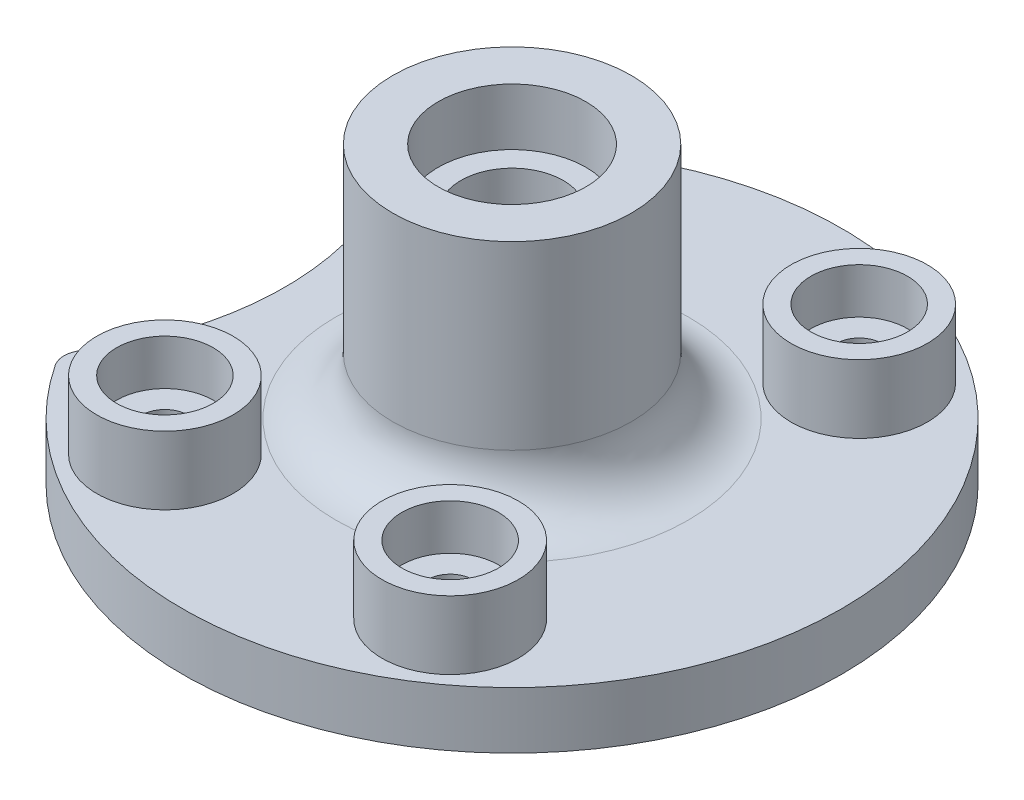
ISO-10303-21;
HEADER;
FILE_DESCRIPTION(('STEP AP214'),'2;1');
FILE_NAME('part.step','',(''),(''),'','','');
FILE_SCHEMA(('AUTOMOTIVE_DESIGN { 1 0 10303 214 1 1 1 1 }'));
ENDSEC;
DATA;
#1=APPLICATION_CONTEXT('core data for automotive mechanical design processes');
#2=APPLICATION_PROTOCOL_DEFINITION('international standard','automotive_design',2000,#1);
#3=PRODUCT_CONTEXT('',#1,'mechanical');
#4=PRODUCT('Part','Part','',(#3));
#5=PRODUCT_RELATED_PRODUCT_CATEGORY('part','',(#4));
#6=PRODUCT_DEFINITION_FORMATION('','',#4);
#7=PRODUCT_DEFINITION_CONTEXT('part definition',#1,'design');
#8=PRODUCT_DEFINITION('design','',#6,#7);
#9=PRODUCT_DEFINITION_SHAPE('','',#8);
#10=(LENGTH_UNIT() NAMED_UNIT(*) SI_UNIT(.MILLI.,.METRE.));
#11=(NAMED_UNIT(*) PLANE_ANGLE_UNIT() SI_UNIT($,.RADIAN.));
#12=(NAMED_UNIT(*) SI_UNIT($,.STERADIAN.) SOLID_ANGLE_UNIT());
#13=UNCERTAINTY_MEASURE_WITH_UNIT(LENGTH_MEASURE(1.E-05),#10,'distance_accuracy_value','');
#14=(GEOMETRIC_REPRESENTATION_CONTEXT(3) GLOBAL_UNCERTAINTY_ASSIGNED_CONTEXT((#13)) GLOBAL_UNIT_ASSIGNED_CONTEXT((#10,
#11,#12)) REPRESENTATION_CONTEXT('',''));
#15=CARTESIAN_POINT('',(0.,0.,0.));
#16=DIRECTION('',(0.,0.,1.));
#17=DIRECTION('',(1.,0.,0.));
#18=AXIS2_PLACEMENT_3D('',#15,#16,#17);
#19=CARTESIAN_POINT('',(12.5507555926685,-15.9,-17.998053071223));
#20=DIRECTION('',(0.,1.,0.));
#21=DIRECTION('',(0.,0.,1.));
#22=AXIS2_PLACEMENT_3D('',#19,#20,#21);
#23=CYLINDRICAL_SURFACE('',#22,2.);
#24=CARTESIAN_POINT('',(12.5507555926685,-8.9,-17.998053071223));
#25=DIRECTION('',(0.,1.,0.));
#26=DIRECTION('',(0.,0.,1.));
#27=AXIS2_PLACEMENT_3D('',#24,#25,#26);
#28=CIRCLE('',#27,2.);
#29=CARTESIAN_POINT('',(12.5507555926685,-8.9,-15.998053071223));
#30=VERTEX_POINT('',#29);
#31=EDGE_CURVE('E116',#30,#30,#28,.F.);
#32=ORIENTED_EDGE('',*,*,#31,.F.);
#33=EDGE_LOOP('',(#32));
#34=FACE_BOUND('',#33,.T.);
#35=CARTESIAN_POINT('',(12.5507555926685,-12.9,-17.998053071223));
#36=DIRECTION('',(0.,-1.,0.));
#37=DIRECTION('',(0.,0.,-1.));
#38=AXIS2_PLACEMENT_3D('',#35,#36,#37);
#39=CIRCLE('',#38,2.);
#40=CARTESIAN_POINT('',(12.5507555926685,-12.9,-19.998053071223));
#41=VERTEX_POINT('',#40);
#42=EDGE_CURVE('E42',#41,#41,#39,.T.);
#43=ORIENTED_EDGE('',*,*,#42,.T.);
#44=EDGE_LOOP('',(#43));
#45=FACE_BOUND('',#44,.T.);
#46=ADVANCED_FACE('F38',(#34,#45),#23,.F.);
#47=CARTESIAN_POINT('',(12.5507555926685,-15.9,17.998053071223));
#48=DIRECTION('',(0.,1.,0.));
#49=DIRECTION('',(0.,0.,1.));
#50=AXIS2_PLACEMENT_3D('',#47,#48,#49);
#51=CYLINDRICAL_SURFACE('',#50,2.);
#52=CARTESIAN_POINT('',(12.5507555926685,-8.9,17.998053071223));
#53=DIRECTION('',(0.,1.,0.));
#54=DIRECTION('',(0.,0.,1.));
#55=AXIS2_PLACEMENT_3D('',#52,#53,#54);
#56=CIRCLE('',#55,2.);
#57=CARTESIAN_POINT('',(12.5507555926685,-8.9,19.998053071223));
#58=VERTEX_POINT('',#57);
#59=EDGE_CURVE('E119',#58,#58,#56,.F.);
#60=ORIENTED_EDGE('',*,*,#59,.F.);
#61=EDGE_LOOP('',(#60));
#62=FACE_BOUND('',#61,.T.);
#63=CARTESIAN_POINT('',(12.5507555926685,-12.9,17.998053071223));
#64=DIRECTION('',(0.,-1.,0.));
#65=DIRECTION('',(0.,0.,-1.));
#66=AXIS2_PLACEMENT_3D('',#63,#64,#65);
#67=CIRCLE('',#66,2.);
#68=CARTESIAN_POINT('',(12.5507555926685,-12.9,15.998053071223));
#69=VERTEX_POINT('',#68);
#70=EDGE_CURVE('E122',#69,#69,#67,.T.);
#71=ORIENTED_EDGE('',*,*,#70,.T.);
#72=EDGE_LOOP('',(#71));
#73=FACE_BOUND('',#72,.T.);
#74=ADVANCED_FACE('F245',(#62,#73),#51,.F.);
#75=CARTESIAN_POINT('',(-12.5507555926685,-15.9,-17.998053071223));
#76=DIRECTION('',(0.,1.,0.));
#77=DIRECTION('',(0.,0.,1.));
#78=AXIS2_PLACEMENT_3D('',#75,#76,#77);
#79=CYLINDRICAL_SURFACE('',#78,2.);
#80=CARTESIAN_POINT('',(-12.5507555926685,-8.9,-17.998053071223));
#81=DIRECTION('',(0.,1.,0.));
#82=DIRECTION('',(0.,0.,1.));
#83=AXIS2_PLACEMENT_3D('',#80,#81,#82);
#84=CIRCLE('',#83,2.);
#85=CARTESIAN_POINT('',(-12.5507555926685,-8.9,-15.998053071223));
#86=VERTEX_POINT('',#85);
#87=EDGE_CURVE('E230',#86,#86,#84,.T.);
#88=ORIENTED_EDGE('',*,*,#87,.T.);
#89=EDGE_LOOP('',(#88));
#90=FACE_BOUND('',#89,.T.);
#91=CARTESIAN_POINT('',(-12.5507555926685,-12.9,-17.998053071223));
#92=DIRECTION('',(0.,-1.,0.));
#93=DIRECTION('',(0.,0.,-1.));
#94=AXIS2_PLACEMENT_3D('',#91,#92,#93);
#95=CIRCLE('',#94,2.);
#96=CARTESIAN_POINT('',(-12.5507555926685,-12.9,-19.998053071223));
#97=VERTEX_POINT('',#96);
#98=EDGE_CURVE('E108',#97,#97,#95,.F.);
#99=ORIENTED_EDGE('',*,*,#98,.F.);
#100=EDGE_LOOP('',(#99));
#101=FACE_BOUND('',#100,.T.);
#102=ADVANCED_FACE('F242',(#90,#101),#79,.F.);
#103=CARTESIAN_POINT('',(-12.5507555926685,-15.9,17.998053071223));
#104=DIRECTION('',(0.,1.,0.));
#105=DIRECTION('',(0.,0.,1.));
#106=AXIS2_PLACEMENT_3D('',#103,#104,#105);
#107=CYLINDRICAL_SURFACE('',#106,2.);
#108=CARTESIAN_POINT('',(-12.5507555926685,-8.9,17.998053071223));
#109=DIRECTION('',(0.,1.,0.));
#110=DIRECTION('',(0.,0.,1.));
#111=AXIS2_PLACEMENT_3D('',#108,#109,#110);
#112=CIRCLE('',#111,2.);
#113=CARTESIAN_POINT('',(-12.5507555926685,-8.9,19.998053071223));
#114=VERTEX_POINT('',#113);
#115=EDGE_CURVE('E182',#114,#114,#112,.T.);
#116=ORIENTED_EDGE('',*,*,#115,.T.);
#117=EDGE_LOOP('',(#116));
#118=FACE_BOUND('',#117,.T.);
#119=CARTESIAN_POINT('',(-12.5507555926685,-12.9,17.998053071223));
#120=DIRECTION('',(0.,-1.,0.));
#121=DIRECTION('',(0.,0.,-1.));
#122=AXIS2_PLACEMENT_3D('',#119,#120,#121);
#123=CIRCLE('',#122,2.);
#124=CARTESIAN_POINT('',(-12.5507555926685,-12.9,15.998053071223));
#125=VERTEX_POINT('',#124);
#126=EDGE_CURVE('E169',#125,#125,#123,.F.);
#127=ORIENTED_EDGE('',*,*,#126,.F.);
#128=EDGE_LOOP('',(#127));
#129=FACE_BOUND('',#128,.T.);
#130=ADVANCED_FACE('F244',(#118,#129),#107,.F.);
#131=CARTESIAN_POINT('',(0.,-5.,-6.5));
#132=DIRECTION('',(0.,-1.,0.));
#133=DIRECTION('',(0.,0.,-1.));
#134=AXIS2_PLACEMENT_3D('',#131,#132,#133);
#135=PLANE('',#134);
#136=CARTESIAN_POINT('',(0.,-5.,0.));
#137=DIRECTION('',(0.,-1.,0.));
#138=DIRECTION('',(0.,0.,-1.));
#139=AXIS2_PLACEMENT_3D('',#136,#137,#138);
#140=CIRCLE('',#139,6.5);
#141=CARTESIAN_POINT('',(0.,-5.,-6.5));
#142=VERTEX_POINT('',#141);
#143=EDGE_CURVE('E210',#142,#142,#140,.T.);
#144=ORIENTED_EDGE('',*,*,#143,.T.);
#145=EDGE_LOOP('',(#144));
#146=FACE_BOUND('',#145,.T.);
#147=CARTESIAN_POINT('',(0.,-5.,0.));
#148=DIRECTION('',(0.,-1.,0.));
#149=DIRECTION('',(0.,0.,-1.));
#150=AXIS2_PLACEMENT_3D('',#147,#148,#149);
#151=CIRCLE('',#150,4.5);
#152=CARTESIAN_POINT('',(0.,-5.,-4.5));
#153=VERTEX_POINT('',#152);
#154=EDGE_CURVE('E213',#153,#153,#151,.T.);
#155=ORIENTED_EDGE('',*,*,#154,.F.);
#156=EDGE_LOOP('',(#155));
#157=FACE_BOUND('',#156,.T.);
#158=ADVANCED_FACE('F252',(#146,#157),#135,.T.);
#159=CARTESIAN_POINT('',(0.,0.,0.));
#160=DIRECTION('',(0.,-1.,0.));
#161=DIRECTION('',(0.,0.,-1.));
#162=AXIS2_PLACEMENT_3D('',#159,#160,#161);
#163=CYLINDRICAL_SURFACE('',#162,6.5);
#164=ORIENTED_EDGE('',*,*,#143,.F.);
#165=EDGE_LOOP('',(#164));
#166=FACE_BOUND('',#165,.T.);
#167=CARTESIAN_POINT('',(0.,-15.9,0.));
#168=DIRECTION('',(0.,1.,0.));
#169=DIRECTION('',(0.,0.,1.));
#170=AXIS2_PLACEMENT_3D('',#167,#168,#169);
#171=CIRCLE('',#170,6.5);
#172=CARTESIAN_POINT('',(0.,-15.9,6.5));
#173=VERTEX_POINT('',#172);
#174=EDGE_CURVE('E191',#173,#173,#171,.T.);
#175=ORIENTED_EDGE('',*,*,#174,.F.);
#176=EDGE_LOOP('',(#175));
#177=FACE_BOUND('',#176,.T.);
#178=ADVANCED_FACE('F359',(#166,#177),#163,.F.);
#179=CARTESIAN_POINT('',(0.,0.,0.));
#180=DIRECTION('',(0.,-1.,0.));
#181=DIRECTION('',(0.,0.,-1.));
#182=AXIS2_PLACEMENT_3D('',#179,#180,#181);
#183=CYLINDRICAL_SURFACE('',#182,10.5);
#184=CARTESIAN_POINT('',(0.,-5.9,0.));
#185=DIRECTION('',(0.,-1.,0.));
#186=DIRECTION('',(0.,0.,-1.));
#187=AXIS2_PLACEMENT_3D('',#184,#185,#186);
#188=CIRCLE('',#187,10.5);
#189=CARTESIAN_POINT('',(0.,-5.9,-10.5));
#190=VERTEX_POINT('',#189);
#191=EDGE_CURVE('E219',#190,#190,#188,.F.);
#192=ORIENTED_EDGE('',*,*,#191,.T.);
#193=EDGE_LOOP('',(#192));
#194=FACE_BOUND('',#193,.T.);
#195=CARTESIAN_POINT('',(0.,10.,0.));
#196=DIRECTION('',(0.,-1.,0.));
#197=DIRECTION('',(0.,0.,-1.));
#198=AXIS2_PLACEMENT_3D('',#195,#196,#197);
#199=CIRCLE('',#198,10.5);
#200=CARTESIAN_POINT('',(0.,10.,-10.5));
#201=VERTEX_POINT('',#200);
#202=EDGE_CURVE('E207',#201,#201,#199,.T.);
#203=ORIENTED_EDGE('',*,*,#202,.T.);
#204=EDGE_LOOP('',(#203));
#205=FACE_BOUND('',#204,.T.);
#206=ADVANCED_FACE('F355',(#194,#205),#183,.T.);
#207=CARTESIAN_POINT('',(0.,10.,-6.5));
#208=DIRECTION('',(0.,1.,0.));
#209=DIRECTION('',(0.,0.,1.));
#210=AXIS2_PLACEMENT_3D('',#207,#208,#209);
#211=PLANE('',#210);
#212=CARTESIAN_POINT('',(0.,10.,0.));
#213=DIRECTION('',(0.,-1.,0.));
#214=DIRECTION('',(0.,0.,-1.));
#215=AXIS2_PLACEMENT_3D('',#212,#213,#214);
#216=CIRCLE('',#215,6.5);
#217=CARTESIAN_POINT('',(0.,10.,-6.5));
#218=VERTEX_POINT('',#217);
#219=EDGE_CURVE('E204',#218,#218,#216,.T.);
#220=ORIENTED_EDGE('',*,*,#219,.T.);
#221=EDGE_LOOP('',(#220));
#222=FACE_BOUND('',#221,.T.);
#223=ORIENTED_EDGE('',*,*,#202,.F.);
#224=EDGE_LOOP('',(#223));
#225=FACE_BOUND('',#224,.T.);
#226=ADVANCED_FACE('F351',(#222,#225),#211,.T.);
#227=CARTESIAN_POINT('',(0.,0.,0.));
#228=DIRECTION('',(0.,-1.,0.));
#229=DIRECTION('',(0.,0.,-1.));
#230=AXIS2_PLACEMENT_3D('',#227,#228,#229);
#231=CYLINDRICAL_SURFACE('',#230,6.5);
#232=CARTESIAN_POINT('',(0.,5.,0.));
#233=DIRECTION('',(0.,-1.,0.));
#234=DIRECTION('',(0.,0.,-1.));
#235=AXIS2_PLACEMENT_3D('',#232,#233,#234);
#236=CIRCLE('',#235,6.5);
#237=CARTESIAN_POINT('',(0.,5.,-6.5));
#238=VERTEX_POINT('',#237);
#239=EDGE_CURVE('E201',#238,#238,#236,.T.);
#240=ORIENTED_EDGE('',*,*,#239,.T.);
#241=EDGE_LOOP('',(#240));
#242=FACE_BOUND('',#241,.T.);
#243=ORIENTED_EDGE('',*,*,#219,.F.);
#244=EDGE_LOOP('',(#243));
#245=FACE_BOUND('',#244,.T.);
#246=ADVANCED_FACE('F347',(#242,#245),#231,.F.);
#247=CARTESIAN_POINT('',(0.,5.,-6.5));
#248=DIRECTION('',(0.,1.,0.));
#249=DIRECTION('',(0.,0.,1.));
#250=AXIS2_PLACEMENT_3D('',#247,#248,#249);
#251=PLANE('',#250);
#252=CARTESIAN_POINT('',(0.,5.,0.));
#253=DIRECTION('',(0.,-1.,0.));
#254=DIRECTION('',(0.,0.,-1.));
#255=AXIS2_PLACEMENT_3D('',#252,#253,#254);
#256=CIRCLE('',#255,4.5);
#257=CARTESIAN_POINT('',(0.,5.,-4.5));
#258=VERTEX_POINT('',#257);
#259=EDGE_CURVE('E197',#258,#258,#256,.T.);
#260=ORIENTED_EDGE('',*,*,#259,.T.);
#261=EDGE_LOOP('',(#260));
#262=FACE_BOUND('',#261,.T.);
#263=ORIENTED_EDGE('',*,*,#239,.F.);
#264=EDGE_LOOP('',(#263));
#265=FACE_BOUND('',#264,.T.);
#266=ADVANCED_FACE('F340',(#262,#265),#251,.T.);
#267=CARTESIAN_POINT('',(0.,0.,0.));
#268=DIRECTION('',(0.,-1.,0.));
#269=DIRECTION('',(0.,0.,-1.));
#270=AXIS2_PLACEMENT_3D('',#267,#268,#269);
#271=CYLINDRICAL_SURFACE('',#270,4.5);
#272=ORIENTED_EDGE('',*,*,#154,.T.);
#273=EDGE_LOOP('',(#272));
#274=FACE_BOUND('',#273,.T.);
#275=ORIENTED_EDGE('',*,*,#259,.F.);
#276=EDGE_LOOP('',(#275));
#277=FACE_BOUND('',#276,.T.);
#278=ADVANCED_FACE('F333',(#274,#277),#271,.F.);
#279=CARTESIAN_POINT('',(0.,-15.9,0.));
#280=DIRECTION('',(0.,1.,0.));
#281=DIRECTION('',(0.,0.,1.));
#282=AXIS2_PLACEMENT_3D('',#279,#280,#281);
#283=CYLINDRICAL_SURFACE('',#282,29.);
#284=CARTESIAN_POINT('',(0.,-10.9,0.));
#285=DIRECTION('',(0.,1.,0.));
#286=DIRECTION('',(0.,0.,-1.));
#287=AXIS2_PLACEMENT_3D('',#284,#285,#286);
#288=CIRCLE('',#287,29.);
#289=CARTESIAN_POINT('',(-24.1666666666667,-10.9,16.0303531533844));
#290=VERTEX_POINT('',#289);
#291=CARTESIAN_POINT('',(-24.1666666666667,-10.9,-16.0303531533844));
#292=VERTEX_POINT('',#291);
#293=EDGE_CURVE('E85',#290,#292,#288,.T.);
#294=ORIENTED_EDGE('',*,*,#293,.F.);
#295=DIRECTION('',(0.,1.,0.));
#296=VECTOR('',#295,1.);
#297=CARTESIAN_POINT('',(-24.1666666666667,-15.9,16.0303531533844));
#298=LINE('',#297,#296);
#299=CARTESIAN_POINT('',(-24.1666666666667,-15.9,16.0303531533844));
#300=VERTEX_POINT('',#299);
#301=EDGE_CURVE('E61',#290,#300,#298,.F.);
#302=ORIENTED_EDGE('',*,*,#301,.T.);
#303=CARTESIAN_POINT('',(0.,-15.9,0.));
#304=DIRECTION('',(0.,1.,0.));
#305=DIRECTION('',(0.,0.,-1.));
#306=AXIS2_PLACEMENT_3D('',#303,#304,#305);
#307=CIRCLE('',#306,29.);
#308=CARTESIAN_POINT('',(-24.1666666666667,-15.9,-16.0303531533844));
#309=VERTEX_POINT('',#308);
#310=EDGE_CURVE('E99',#300,#309,#307,.T.);
#311=ORIENTED_EDGE('',*,*,#310,.T.);
#312=DIRECTION('',(0.,1.,0.));
#313=VECTOR('',#312,1.);
#314=CARTESIAN_POINT('',(-24.1666666666667,-15.9,-16.0303531533844));
#315=LINE('',#314,#313);
#316=EDGE_CURVE('E112',#309,#292,#315,.T.);
#317=ORIENTED_EDGE('',*,*,#316,.T.);
#318=EDGE_LOOP('',(#294,#302,#311,#317));
#319=FACE_BOUND('',#318,.T.);
#320=ADVANCED_FACE('F331',(#319),#283,.T.);
#321=CARTESIAN_POINT('',(-45.,-15.9,0.));
#322=DIRECTION('',(0.,1.,0.));
#323=DIRECTION('',(0.,0.,1.));
#324=AXIS2_PLACEMENT_3D('',#321,#322,#323);
#325=CYLINDRICAL_SURFACE('',#324,25.);
#326=CARTESIAN_POINT('',(-45.,-15.9,0.));
#327=DIRECTION('',(0.,-1.,0.));
#328=DIRECTION('',(0.,0.,-1.));
#329=AXIS2_PLACEMENT_3D('',#326,#327,#328);
#330=CIRCLE('',#329,25.);
#331=CARTESIAN_POINT('',(-24.1666666666667,-15.9,-13.8192699598142));
#332=VERTEX_POINT('',#331);
#333=CARTESIAN_POINT('',(-24.1666666666667,-15.9,13.8192699598142));
#334=VERTEX_POINT('',#333);
#335=EDGE_CURVE('E195',#332,#334,#330,.T.);
#336=ORIENTED_EDGE('',*,*,#335,.T.);
#337=DIRECTION('',(0.,1.,0.));
#338=VECTOR('',#337,1.);
#339=CARTESIAN_POINT('',(-24.1666666666667,-15.9,13.8192699598142));
#340=LINE('',#339,#338);
#341=CARTESIAN_POINT('',(-24.1666666666667,-10.9,13.8192699598142));
#342=VERTEX_POINT('',#341);
#343=EDGE_CURVE('E91',#334,#342,#340,.T.);
#344=ORIENTED_EDGE('',*,*,#343,.T.);
#345=CARTESIAN_POINT('',(-45.,-10.9,0.));
#346=DIRECTION('',(0.,-1.,0.));
#347=DIRECTION('',(0.,0.,-1.));
#348=AXIS2_PLACEMENT_3D('',#345,#346,#347);
#349=CIRCLE('',#348,25.);
#350=CARTESIAN_POINT('',(-24.1666666666667,-10.9,-13.8192699598142));
#351=VERTEX_POINT('',#350);
#352=EDGE_CURVE('E84',#351,#342,#349,.T.);
#353=ORIENTED_EDGE('',*,*,#352,.F.);
#354=DIRECTION('',(0.,1.,0.));
#355=VECTOR('',#354,1.);
#356=CARTESIAN_POINT('',(-24.1666666666667,-15.9,-13.8192699598142));
#357=LINE('',#356,#355);
#358=EDGE_CURVE('E97',#351,#332,#357,.F.);
#359=ORIENTED_EDGE('',*,*,#358,.T.);
#360=EDGE_LOOP('',(#336,#344,#353,#359));
#361=FACE_BOUND('',#360,.T.);
#362=ADVANCED_FACE('F96',(#361),#325,.F.);
#363=CARTESIAN_POINT('',(-22.5,-15.9,0.));
#364=DIRECTION('',(0.,-1.,0.));
#365=DIRECTION('',(0.,0.,-1.));
#366=AXIS2_PLACEMENT_3D('',#363,#364,#365);
#367=PLANE('',#366);
#368=CARTESIAN_POINT('',(12.5507555926685,-15.9,17.998053071223));
#369=DIRECTION('',(0.,1.,0.));
#370=DIRECTION('',(0.,0.,-1.));
#371=AXIS2_PLACEMENT_3D('',#368,#369,#370);
#372=CIRCLE('',#371,3.);
#373=CARTESIAN_POINT('',(12.5507555926685,-15.9,14.998053071223));
#374=VERTEX_POINT('',#373);
#375=EDGE_CURVE('E129',#374,#374,#372,.T.);
#376=ORIENTED_EDGE('',*,*,#375,.T.);
#377=EDGE_LOOP('',(#376));
#378=FACE_BOUND('',#377,.T.);
#379=CARTESIAN_POINT('',(12.5507555926685,-15.9,-17.998053071223));
#380=DIRECTION('',(0.,1.,0.));
#381=DIRECTION('',(0.,0.,-1.));
#382=AXIS2_PLACEMENT_3D('',#379,#380,#381);
#383=CIRCLE('',#382,3.);
#384=CARTESIAN_POINT('',(12.5507555926685,-15.9,-20.998053071223));
#385=VERTEX_POINT('',#384);
#386=EDGE_CURVE('E139',#385,#385,#383,.T.);
#387=ORIENTED_EDGE('',*,*,#386,.T.);
#388=EDGE_LOOP('',(#387));
#389=FACE_BOUND('',#388,.T.);
#390=CARTESIAN_POINT('',(-12.5507555926685,-15.9,17.998053071223));
#391=DIRECTION('',(0.,-1.,0.));
#392=DIRECTION('',(0.,0.,-1.));
#393=AXIS2_PLACEMENT_3D('',#390,#391,#392);
#394=CIRCLE('',#393,3.);
#395=CARTESIAN_POINT('',(-12.5507555926685,-15.9,14.998053071223));
#396=VERTEX_POINT('',#395);
#397=EDGE_CURVE('E170',#396,#396,#394,.T.);
#398=ORIENTED_EDGE('',*,*,#397,.F.);
#399=EDGE_LOOP('',(#398));
#400=FACE_BOUND('',#399,.T.);
#401=CARTESIAN_POINT('',(-12.5507555926685,-15.9,-17.998053071223));
#402=DIRECTION('',(0.,-1.,0.));
#403=DIRECTION('',(0.,0.,-1.));
#404=AXIS2_PLACEMENT_3D('',#401,#402,#403);
#405=CIRCLE('',#404,3.);
#406=CARTESIAN_POINT('',(-12.5507555926685,-15.9,-20.998053071223));
#407=VERTEX_POINT('',#406);
#408=EDGE_CURVE('E163',#407,#407,#405,.T.);
#409=ORIENTED_EDGE('',*,*,#408,.F.);
#410=EDGE_LOOP('',(#409));
#411=FACE_BOUND('',#410,.T.);
#412=ORIENTED_EDGE('',*,*,#174,.T.);
#413=EDGE_LOOP('',(#412));
#414=FACE_BOUND('',#413,.T.);
#415=ORIENTED_EDGE('',*,*,#310,.F.);
#416=CARTESIAN_POINT('',(-22.5,-15.9,14.9248115565993));
#417=DIRECTION('',(0.,-1.,0.));
#418=DIRECTION('',(0.,0.,-1.));
#419=AXIS2_PLACEMENT_3D('',#416,#417,#418);
#420=CIRCLE('',#419,2.);
#421=EDGE_CURVE('E11',#300,#334,#420,.T.);
#422=ORIENTED_EDGE('',*,*,#421,.T.);
#423=ORIENTED_EDGE('',*,*,#335,.F.);
#424=CARTESIAN_POINT('',(-22.5,-15.9,-14.9248115565993));
#425=DIRECTION('',(0.,-1.,0.));
#426=DIRECTION('',(0.,0.,-1.));
#427=AXIS2_PLACEMENT_3D('',#424,#425,#426);
#428=CIRCLE('',#427,2.);
#429=EDGE_CURVE('E47',#332,#309,#428,.T.);
#430=ORIENTED_EDGE('',*,*,#429,.T.);
#431=EDGE_LOOP('',(#415,#422,#423,#430));
#432=FACE_BOUND('',#431,.T.);
#433=ADVANCED_FACE('F324',(#378,#389,#400,#411,#414,#432),#367,.T.);
#434=CARTESIAN_POINT('',(-22.5,-10.9,0.));
#435=DIRECTION('',(0.,-1.,0.));
#436=DIRECTION('',(0.,0.,-1.));
#437=AXIS2_PLACEMENT_3D('',#434,#435,#436);
#438=PLANE('',#437);
#439=CARTESIAN_POINT('',(12.5507555926685,-10.9,17.998053071223));
#440=DIRECTION('',(0.,-1.,0.));
#441=DIRECTION('',(0.,0.,-1.));
#442=AXIS2_PLACEMENT_3D('',#439,#440,#441);
#443=CIRCLE('',#442,6.);
#444=CARTESIAN_POINT('',(12.5507555926685,-10.9,11.998053071223));
#445=VERTEX_POINT('',#444);
#446=EDGE_CURVE('E150',#445,#445,#443,.T.);
#447=ORIENTED_EDGE('',*,*,#446,.T.);
#448=EDGE_LOOP('',(#447));
#449=FACE_BOUND('',#448,.T.);
#450=CARTESIAN_POINT('',(12.5507555926685,-10.9,-17.998053071223));
#451=DIRECTION('',(0.,-1.,0.));
#452=DIRECTION('',(0.,0.,1.));
#453=AXIS2_PLACEMENT_3D('',#450,#451,#452);
#454=CIRCLE('',#453,6.);
#455=CARTESIAN_POINT('',(12.5507555926685,-10.9,-11.998053071223));
#456=VERTEX_POINT('',#455);
#457=EDGE_CURVE('E159',#456,#456,#454,.T.);
#458=ORIENTED_EDGE('',*,*,#457,.T.);
#459=EDGE_LOOP('',(#458));
#460=FACE_BOUND('',#459,.T.);
#461=CARTESIAN_POINT('',(-12.5507555926685,-10.9,17.998053071223));
#462=DIRECTION('',(0.,-1.,0.));
#463=DIRECTION('',(0.,0.,-1.));
#464=AXIS2_PLACEMENT_3D('',#461,#462,#463);
#465=CIRCLE('',#464,6.);
#466=CARTESIAN_POINT('',(-12.5507555926685,-10.9,11.998053071223));
#467=VERTEX_POINT('',#466);
#468=EDGE_CURVE('E225',#467,#467,#465,.F.);
#469=ORIENTED_EDGE('',*,*,#468,.F.);
#470=EDGE_LOOP('',(#469));
#471=FACE_BOUND('',#470,.T.);
#472=CARTESIAN_POINT('',(-12.5507555926685,-10.9,-17.998053071223));
#473=DIRECTION('',(0.,-1.,0.));
#474=DIRECTION('',(0.,0.,-1.));
#475=AXIS2_PLACEMENT_3D('',#472,#473,#474);
#476=CIRCLE('',#475,6.);
#477=CARTESIAN_POINT('',(-12.5507555926685,-10.9,-23.998053071223));
#478=VERTEX_POINT('',#477);
#479=EDGE_CURVE('E222',#478,#478,#476,.F.);
#480=ORIENTED_EDGE('',*,*,#479,.F.);
#481=EDGE_LOOP('',(#480));
#482=FACE_BOUND('',#481,.T.);
#483=CARTESIAN_POINT('',(0.,-10.9,0.));
#484=DIRECTION('',(0.,-1.,0.));
#485=DIRECTION('',(0.,0.,-1.));
#486=AXIS2_PLACEMENT_3D('',#483,#484,#485);
#487=CIRCLE('',#486,15.5);
#488=CARTESIAN_POINT('',(0.,-10.9,-15.5));
#489=VERTEX_POINT('',#488);
#490=EDGE_CURVE('E216',#489,#489,#487,.T.);
#491=ORIENTED_EDGE('',*,*,#490,.T.);
#492=EDGE_LOOP('',(#491));
#493=FACE_BOUND('',#492,.T.);
#494=ORIENTED_EDGE('',*,*,#352,.T.);
#495=CARTESIAN_POINT('',(-22.5,-10.9,14.9248115565993));
#496=DIRECTION('',(0.,-1.,0.));
#497=DIRECTION('',(0.,0.,-1.));
#498=AXIS2_PLACEMENT_3D('',#495,#496,#497);
#499=CIRCLE('',#498,2.);
#500=EDGE_CURVE('E90',#342,#290,#499,.F.);
#501=ORIENTED_EDGE('',*,*,#500,.T.);
#502=ORIENTED_EDGE('',*,*,#293,.T.);
#503=CARTESIAN_POINT('',(-22.5,-10.9,-14.9248115565993));
#504=DIRECTION('',(0.,-1.,0.));
#505=DIRECTION('',(0.,0.,-1.));
#506=AXIS2_PLACEMENT_3D('',#503,#504,#505);
#507=CIRCLE('',#506,2.);
#508=EDGE_CURVE('E81',#292,#351,#507,.F.);
#509=ORIENTED_EDGE('',*,*,#508,.T.);
#510=EDGE_LOOP('',(#494,#501,#502,#509));
#511=FACE_BOUND('',#510,.T.);
#512=ADVANCED_FACE('F83',(#449,#460,#471,#482,#493,#511),#438,.F.);
#513=CARTESIAN_POINT('',(0.,-5.9,0.));
#514=DIRECTION('',(0.,-1.,0.));
#515=DIRECTION('',(0.,0.,-1.));
#516=AXIS2_PLACEMENT_3D('',#513,#514,#515);
#517=TOROIDAL_SURFACE('',#516,15.5,5.);
#518=ORIENTED_EDGE('',*,*,#191,.F.);
#519=EDGE_LOOP('',(#518));
#520=FACE_BOUND('',#519,.T.);
#521=ORIENTED_EDGE('',*,*,#490,.F.);
#522=EDGE_LOOP('',(#521));
#523=FACE_BOUND('',#522,.T.);
#524=ADVANCED_FACE('F367',(#520,#523),#517,.F.);
#525=CARTESIAN_POINT('',(-12.5507555926685,-4.9,-17.998053071223));
#526=DIRECTION('',(0.,1.,0.));
#527=DIRECTION('',(0.,0.,1.));
#528=AXIS2_PLACEMENT_3D('',#525,#526,#527);
#529=PLANE('',#528);
#530=CARTESIAN_POINT('',(-12.5507555926685,-4.9,-17.998053071223));
#531=DIRECTION('',(0.,1.,0.));
#532=DIRECTION('',(0.,0.,1.));
#533=AXIS2_PLACEMENT_3D('',#530,#531,#532);
#534=CIRCLE('',#533,6.);
#535=CARTESIAN_POINT('',(-12.5507555926685,-4.9,-11.998053071223));
#536=VERTEX_POINT('',#535);
#537=EDGE_CURVE('E188',#536,#536,#534,.T.);
#538=ORIENTED_EDGE('',*,*,#537,.T.);
#539=EDGE_LOOP('',(#538));
#540=FACE_BOUND('',#539,.T.);
#541=CARTESIAN_POINT('',(-12.5507555926685,-4.9,-17.998053071223));
#542=DIRECTION('',(0.,1.,0.));
#543=DIRECTION('',(0.,0.,1.));
#544=AXIS2_PLACEMENT_3D('',#541,#542,#543);
#545=CIRCLE('',#544,4.25);
#546=CARTESIAN_POINT('',(-12.5507555926685,-4.9,-13.748053071223));
#547=VERTEX_POINT('',#546);
#548=EDGE_CURVE('E185',#547,#547,#545,.T.);
#549=ORIENTED_EDGE('',*,*,#548,.F.);
#550=EDGE_LOOP('',(#549));
#551=FACE_BOUND('',#550,.T.);
#552=ADVANCED_FACE('F369',(#540,#551),#529,.T.);
#553=CARTESIAN_POINT('',(-12.5507555926685,-4.9,-17.998053071223));
#554=DIRECTION('',(0.,-1.,0.));
#555=DIRECTION('',(0.,0.,-1.));
#556=AXIS2_PLACEMENT_3D('',#553,#554,#555);
#557=CYLINDRICAL_SURFACE('',#556,6.);
#558=ORIENTED_EDGE('',*,*,#537,.F.);
#559=EDGE_LOOP('',(#558));
#560=FACE_BOUND('',#559,.T.);
#561=ORIENTED_EDGE('',*,*,#479,.T.);
#562=EDGE_LOOP('',(#561));
#563=FACE_BOUND('',#562,.T.);
#564=ADVANCED_FACE('F375',(#560,#563),#557,.T.);
#565=CARTESIAN_POINT('',(-12.5507555926685,-4.9,-17.998053071223));
#566=DIRECTION('',(0.,-1.,0.));
#567=DIRECTION('',(0.,0.,-1.));
#568=AXIS2_PLACEMENT_3D('',#565,#566,#567);
#569=CYLINDRICAL_SURFACE('',#568,4.25);
#570=CARTESIAN_POINT('',(-12.5507555926685,-8.9,-17.998053071223));
#571=DIRECTION('',(0.,1.,0.));
#572=DIRECTION('',(0.,0.,1.));
#573=AXIS2_PLACEMENT_3D('',#570,#571,#572);
#574=CIRCLE('',#573,4.25);
#575=CARTESIAN_POINT('',(-12.5507555926685,-8.9,-13.748053071223));
#576=VERTEX_POINT('',#575);
#577=EDGE_CURVE('E101',#576,#576,#574,.T.);
#578=ORIENTED_EDGE('',*,*,#577,.F.);
#579=EDGE_LOOP('',(#578));
#580=FACE_BOUND('',#579,.T.);
#581=ORIENTED_EDGE('',*,*,#548,.T.);
#582=EDGE_LOOP('',(#581));
#583=FACE_BOUND('',#582,.T.);
#584=ADVANCED_FACE('F391',(#580,#583),#569,.F.);
#585=CARTESIAN_POINT('',(-12.5507555926685,-4.9,17.998053071223));
#586=DIRECTION('',(0.,-1.,0.));
#587=DIRECTION('',(0.,0.,-1.));
#588=AXIS2_PLACEMENT_3D('',#585,#586,#587);
#589=PLANE('',#588);
#590=CARTESIAN_POINT('',(-12.5507555926685,-4.9,17.998053071223));
#591=DIRECTION('',(0.,1.,0.));
#592=DIRECTION('',(0.,0.,-1.));
#593=AXIS2_PLACEMENT_3D('',#590,#591,#592);
#594=CIRCLE('',#593,6.);
#595=CARTESIAN_POINT('',(-12.5507555926685,-4.9,11.998053071223));
#596=VERTEX_POINT('',#595);
#597=EDGE_CURVE('E181',#596,#596,#594,.T.);
#598=ORIENTED_EDGE('',*,*,#597,.T.);
#599=EDGE_LOOP('',(#598));
#600=FACE_BOUND('',#599,.T.);
#601=CARTESIAN_POINT('',(-12.5507555926685,-4.9,17.998053071223));
#602=DIRECTION('',(0.,1.,0.));
#603=DIRECTION('',(0.,0.,-1.));
#604=AXIS2_PLACEMENT_3D('',#601,#602,#603);
#605=CIRCLE('',#604,4.25);
#606=CARTESIAN_POINT('',(-12.5507555926685,-4.9,13.748053071223));
#607=VERTEX_POINT('',#606);
#608=EDGE_CURVE('E178',#607,#607,#605,.T.);
#609=ORIENTED_EDGE('',*,*,#608,.F.);
#610=EDGE_LOOP('',(#609));
#611=FACE_BOUND('',#610,.T.);
#612=ADVANCED_FACE('F396',(#600,#611),#589,.F.);
#613=CARTESIAN_POINT('',(-12.5507555926685,-4.9,17.998053071223));
#614=DIRECTION('',(0.,-1.,0.));
#615=DIRECTION('',(0.,0.,-1.));
#616=AXIS2_PLACEMENT_3D('',#613,#614,#615);
#617=CYLINDRICAL_SURFACE('',#616,6.);
#618=ORIENTED_EDGE('',*,*,#597,.F.);
#619=EDGE_LOOP('',(#618));
#620=FACE_BOUND('',#619,.T.);
#621=ORIENTED_EDGE('',*,*,#468,.T.);
#622=EDGE_LOOP('',(#621));
#623=FACE_BOUND('',#622,.T.);
#624=ADVANCED_FACE('F398',(#620,#623),#617,.T.);
#625=CARTESIAN_POINT('',(-12.5507555926685,-4.9,17.998053071223));
#626=DIRECTION('',(0.,-1.,0.));
#627=DIRECTION('',(0.,0.,-1.));
#628=AXIS2_PLACEMENT_3D('',#625,#626,#627);
#629=CYLINDRICAL_SURFACE('',#628,4.25);
#630=CARTESIAN_POINT('',(-12.5507555926685,-8.9,17.998053071223));
#631=DIRECTION('',(0.,1.,0.));
#632=DIRECTION('',(0.,0.,1.));
#633=AXIS2_PLACEMENT_3D('',#630,#631,#632);
#634=CIRCLE('',#633,4.25);
#635=CARTESIAN_POINT('',(-12.5507555926685,-8.9,22.248053071223));
#636=VERTEX_POINT('',#635);
#637=EDGE_CURVE('E105',#636,#636,#634,.T.);
#638=ORIENTED_EDGE('',*,*,#637,.F.);
#639=EDGE_LOOP('',(#638));
#640=FACE_BOUND('',#639,.T.);
#641=ORIENTED_EDGE('',*,*,#608,.T.);
#642=EDGE_LOOP('',(#641));
#643=FACE_BOUND('',#642,.T.);
#644=ADVANCED_FACE('F401',(#640,#643),#629,.F.);
#645=CARTESIAN_POINT('',(-12.5507555926685,-8.9,17.998053071223));
#646=DIRECTION('',(0.,1.,0.));
#647=DIRECTION('',(0.,0.,1.));
#648=AXIS2_PLACEMENT_3D('',#645,#646,#647);
#649=PLANE('',#648);
#650=ORIENTED_EDGE('',*,*,#115,.F.);
#651=EDGE_LOOP('',(#650));
#652=FACE_BOUND('',#651,.T.);
#653=ORIENTED_EDGE('',*,*,#637,.T.);
#654=EDGE_LOOP('',(#653));
#655=FACE_BOUND('',#654,.T.);
#656=ADVANCED_FACE('F408',(#652,#655),#649,.T.);
#657=CARTESIAN_POINT('',(-12.5507555926685,-8.9,-17.998053071223));
#658=DIRECTION('',(0.,1.,0.));
#659=DIRECTION('',(0.,0.,1.));
#660=AXIS2_PLACEMENT_3D('',#657,#658,#659);
#661=PLANE('',#660);
#662=ORIENTED_EDGE('',*,*,#87,.F.);
#663=EDGE_LOOP('',(#662));
#664=FACE_BOUND('',#663,.T.);
#665=ORIENTED_EDGE('',*,*,#577,.T.);
#666=EDGE_LOOP('',(#665));
#667=FACE_BOUND('',#666,.T.);
#668=ADVANCED_FACE('F304',(#664,#667),#661,.T.);
#669=CARTESIAN_POINT('',(-12.5507555926685,-12.9,17.998053071223));
#670=DIRECTION('',(0.,-1.,0.));
#671=DIRECTION('',(0.,0.,-1.));
#672=AXIS2_PLACEMENT_3D('',#669,#670,#671);
#673=PLANE('',#672);
#674=CARTESIAN_POINT('',(-12.5507555926685,-12.9,17.998053071223));
#675=DIRECTION('',(0.,-1.,0.));
#676=DIRECTION('',(0.,0.,-1.));
#677=AXIS2_PLACEMENT_3D('',#674,#675,#676);
#678=CIRCLE('',#677,3.);
#679=CARTESIAN_POINT('',(-12.5507555926685,-12.9,14.998053071223));
#680=VERTEX_POINT('',#679);
#681=EDGE_CURVE('E166',#680,#680,#678,.T.);
#682=ORIENTED_EDGE('',*,*,#681,.T.);
#683=EDGE_LOOP('',(#682));
#684=FACE_BOUND('',#683,.T.);
#685=ORIENTED_EDGE('',*,*,#126,.T.);
#686=EDGE_LOOP('',(#685));
#687=FACE_BOUND('',#686,.T.);
#688=ADVANCED_FACE('F300',(#684,#687),#673,.T.);
#689=CARTESIAN_POINT('',(-12.5507555926685,-12.9,17.998053071223));
#690=DIRECTION('',(0.,-1.,0.));
#691=DIRECTION('',(0.,0.,-1.));
#692=AXIS2_PLACEMENT_3D('',#689,#690,#691);
#693=CYLINDRICAL_SURFACE('',#692,3.);
#694=ORIENTED_EDGE('',*,*,#681,.F.);
#695=EDGE_LOOP('',(#694));
#696=FACE_BOUND('',#695,.T.);
#697=ORIENTED_EDGE('',*,*,#397,.T.);
#698=EDGE_LOOP('',(#697));
#699=FACE_BOUND('',#698,.T.);
#700=ADVANCED_FACE('F303',(#696,#699),#693,.F.);
#701=CARTESIAN_POINT('',(-12.5507555926685,-12.9,-17.998053071223));
#702=DIRECTION('',(0.,-1.,0.));
#703=DIRECTION('',(0.,0.,-1.));
#704=AXIS2_PLACEMENT_3D('',#701,#702,#703);
#705=PLANE('',#704);
#706=CARTESIAN_POINT('',(-12.5507555926685,-12.9,-17.998053071223));
#707=DIRECTION('',(0.,-1.,0.));
#708=DIRECTION('',(0.,0.,-1.));
#709=AXIS2_PLACEMENT_3D('',#706,#707,#708);
#710=CIRCLE('',#709,3.);
#711=CARTESIAN_POINT('',(-12.5507555926685,-12.9,-20.998053071223));
#712=VERTEX_POINT('',#711);
#713=EDGE_CURVE('E173',#712,#712,#710,.T.);
#714=ORIENTED_EDGE('',*,*,#713,.T.);
#715=EDGE_LOOP('',(#714));
#716=FACE_BOUND('',#715,.T.);
#717=ORIENTED_EDGE('',*,*,#98,.T.);
#718=EDGE_LOOP('',(#717));
#719=FACE_BOUND('',#718,.T.);
#720=ADVANCED_FACE('F240',(#716,#719),#705,.T.);
#721=CARTESIAN_POINT('',(-12.5507555926685,-12.9,-17.998053071223));
#722=DIRECTION('',(0.,-1.,0.));
#723=DIRECTION('',(0.,0.,-1.));
#724=AXIS2_PLACEMENT_3D('',#721,#722,#723);
#725=CYLINDRICAL_SURFACE('',#724,3.);
#726=ORIENTED_EDGE('',*,*,#713,.F.);
#727=EDGE_LOOP('',(#726));
#728=FACE_BOUND('',#727,.T.);
#729=ORIENTED_EDGE('',*,*,#408,.T.);
#730=EDGE_LOOP('',(#729));
#731=FACE_BOUND('',#730,.T.);
#732=ADVANCED_FACE('F311',(#728,#731),#725,.F.);
#733=CARTESIAN_POINT('',(-22.5,-15.9,14.9248115565993));
#734=DIRECTION('',(0.,-1.,0.));
#735=DIRECTION('',(0.,0.,-1.));
#736=AXIS2_PLACEMENT_3D('',#733,#734,#735);
#737=CYLINDRICAL_SURFACE('',#736,2.);
#738=ORIENTED_EDGE('',*,*,#421,.F.);
#739=ORIENTED_EDGE('',*,*,#301,.F.);
#740=ORIENTED_EDGE('',*,*,#500,.F.);
#741=ORIENTED_EDGE('',*,*,#343,.F.);
#742=EDGE_LOOP('',(#738,#739,#740,#741));
#743=FACE_BOUND('',#742,.T.);
#744=ADVANCED_FACE('F314',(#743),#737,.T.);
#745=CARTESIAN_POINT('',(-22.5,-15.9,-14.9248115565993));
#746=DIRECTION('',(0.,-1.,0.));
#747=DIRECTION('',(0.,0.,-1.));
#748=AXIS2_PLACEMENT_3D('',#745,#746,#747);
#749=CYLINDRICAL_SURFACE('',#748,2.);
#750=ORIENTED_EDGE('',*,*,#429,.F.);
#751=ORIENTED_EDGE('',*,*,#358,.F.);
#752=ORIENTED_EDGE('',*,*,#508,.F.);
#753=ORIENTED_EDGE('',*,*,#316,.F.);
#754=EDGE_LOOP('',(#750,#751,#752,#753));
#755=FACE_BOUND('',#754,.T.);
#756=ADVANCED_FACE('F40',(#755),#749,.T.);
#757=CARTESIAN_POINT('',(12.5507555926685,-4.9,-17.998053071223));
#758=DIRECTION('',(0.,-1.,0.));
#759=DIRECTION('',(0.,0.,-1.));
#760=AXIS2_PLACEMENT_3D('',#757,#758,#759);
#761=CYLINDRICAL_SURFACE('',#760,6.);
#762=CARTESIAN_POINT('',(12.5507555926685,-4.9,-17.998053071223));
#763=DIRECTION('',(0.,-1.,0.));
#764=DIRECTION('',(0.,0.,1.));
#765=AXIS2_PLACEMENT_3D('',#762,#763,#764);
#766=CIRCLE('',#765,6.);
#767=CARTESIAN_POINT('',(12.5507555926685,-4.9,-11.998053071223));
#768=VERTEX_POINT('',#767);
#769=EDGE_CURVE('E160',#768,#768,#766,.T.);
#770=ORIENTED_EDGE('',*,*,#769,.T.);
#771=EDGE_LOOP('',(#770));
#772=FACE_BOUND('',#771,.T.);
#773=ORIENTED_EDGE('',*,*,#457,.F.);
#774=EDGE_LOOP('',(#773));
#775=FACE_BOUND('',#774,.T.);
#776=ADVANCED_FACE('F295',(#772,#775),#761,.T.);
#777=CARTESIAN_POINT('',(12.5507555926685,-4.9,-17.998053071223));
#778=DIRECTION('',(0.,1.,0.));
#779=DIRECTION('',(0.,0.,1.));
#780=AXIS2_PLACEMENT_3D('',#777,#778,#779);
#781=PLANE('',#780);
#782=CARTESIAN_POINT('',(12.5507555926685,-4.9,-17.998053071223));
#783=DIRECTION('',(0.,-1.,0.));
#784=DIRECTION('',(0.,0.,1.));
#785=AXIS2_PLACEMENT_3D('',#782,#783,#784);
#786=CIRCLE('',#785,4.25);
#787=CARTESIAN_POINT('',(12.5507555926685,-4.9,-13.748053071223));
#788=VERTEX_POINT('',#787);
#789=EDGE_CURVE('E154',#788,#788,#786,.T.);
#790=ORIENTED_EDGE('',*,*,#789,.T.);
#791=EDGE_LOOP('',(#790));
#792=FACE_BOUND('',#791,.T.);
#793=ORIENTED_EDGE('',*,*,#769,.F.);
#794=EDGE_LOOP('',(#793));
#795=FACE_BOUND('',#794,.T.);
#796=ADVANCED_FACE('F291',(#792,#795),#781,.T.);
#797=CARTESIAN_POINT('',(12.5507555926685,-4.9,-17.998053071223));
#798=DIRECTION('',(0.,-1.,0.));
#799=DIRECTION('',(0.,0.,-1.));
#800=AXIS2_PLACEMENT_3D('',#797,#798,#799);
#801=CYLINDRICAL_SURFACE('',#800,4.25);
#802=CARTESIAN_POINT('',(12.5507555926685,-8.9,-17.998053071223));
#803=DIRECTION('',(0.,-1.,0.));
#804=DIRECTION('',(0.,0.,1.));
#805=AXIS2_PLACEMENT_3D('',#802,#803,#804);
#806=CIRCLE('',#805,4.25);
#807=CARTESIAN_POINT('',(12.5507555926685,-8.9,-13.748053071223));
#808=VERTEX_POINT('',#807);
#809=EDGE_CURVE('E121',#808,#808,#806,.T.);
#810=ORIENTED_EDGE('',*,*,#809,.T.);
#811=EDGE_LOOP('',(#810));
#812=FACE_BOUND('',#811,.T.);
#813=ORIENTED_EDGE('',*,*,#789,.F.);
#814=EDGE_LOOP('',(#813));
#815=FACE_BOUND('',#814,.T.);
#816=ADVANCED_FACE('F287',(#812,#815),#801,.F.);
#817=CARTESIAN_POINT('',(12.5507555926685,-4.9,17.998053071223));
#818=DIRECTION('',(0.,-1.,0.));
#819=DIRECTION('',(0.,0.,-1.));
#820=AXIS2_PLACEMENT_3D('',#817,#818,#819);
#821=CYLINDRICAL_SURFACE('',#820,6.);
#822=CARTESIAN_POINT('',(12.5507555926685,-4.9,17.998053071223));
#823=DIRECTION('',(0.,-1.,0.));
#824=DIRECTION('',(0.,0.,-1.));
#825=AXIS2_PLACEMENT_3D('',#822,#823,#824);
#826=CIRCLE('',#825,6.);
#827=CARTESIAN_POINT('',(12.5507555926685,-4.9,11.998053071223));
#828=VERTEX_POINT('',#827);
#829=EDGE_CURVE('E151',#828,#828,#826,.T.);
#830=ORIENTED_EDGE('',*,*,#829,.T.);
#831=EDGE_LOOP('',(#830));
#832=FACE_BOUND('',#831,.T.);
#833=ORIENTED_EDGE('',*,*,#446,.F.);
#834=EDGE_LOOP('',(#833));
#835=FACE_BOUND('',#834,.T.);
#836=ADVANCED_FACE('F283',(#832,#835),#821,.T.);
#837=CARTESIAN_POINT('',(12.5507555926685,-4.9,17.998053071223));
#838=DIRECTION('',(0.,-1.,0.));
#839=DIRECTION('',(0.,0.,-1.));
#840=AXIS2_PLACEMENT_3D('',#837,#838,#839);
#841=PLANE('',#840);
#842=CARTESIAN_POINT('',(12.5507555926685,-4.9,17.998053071223));
#843=DIRECTION('',(0.,-1.,0.));
#844=DIRECTION('',(0.,0.,-1.));
#845=AXIS2_PLACEMENT_3D('',#842,#843,#844);
#846=CIRCLE('',#845,4.25);
#847=CARTESIAN_POINT('',(12.5507555926685,-4.9,13.748053071223));
#848=VERTEX_POINT('',#847);
#849=EDGE_CURVE('E147',#848,#848,#846,.T.);
#850=ORIENTED_EDGE('',*,*,#849,.T.);
#851=EDGE_LOOP('',(#850));
#852=FACE_BOUND('',#851,.T.);
#853=ORIENTED_EDGE('',*,*,#829,.F.);
#854=EDGE_LOOP('',(#853));
#855=FACE_BOUND('',#854,.T.);
#856=ADVANCED_FACE('F279',(#852,#855),#841,.F.);
#857=CARTESIAN_POINT('',(12.5507555926685,-4.9,17.998053071223));
#858=DIRECTION('',(0.,-1.,0.));
#859=DIRECTION('',(0.,0.,-1.));
#860=AXIS2_PLACEMENT_3D('',#857,#858,#859);
#861=CYLINDRICAL_SURFACE('',#860,4.25);
#862=CARTESIAN_POINT('',(12.5507555926685,-8.9,17.998053071223));
#863=DIRECTION('',(0.,-1.,0.));
#864=DIRECTION('',(0.,0.,1.));
#865=AXIS2_PLACEMENT_3D('',#862,#863,#864);
#866=CIRCLE('',#865,4.25);
#867=CARTESIAN_POINT('',(12.5507555926685,-8.9,22.248053071223));
#868=VERTEX_POINT('',#867);
#869=EDGE_CURVE('E144',#868,#868,#866,.T.);
#870=ORIENTED_EDGE('',*,*,#869,.T.);
#871=EDGE_LOOP('',(#870));
#872=FACE_BOUND('',#871,.T.);
#873=ORIENTED_EDGE('',*,*,#849,.F.);
#874=EDGE_LOOP('',(#873));
#875=FACE_BOUND('',#874,.T.);
#876=ADVANCED_FACE('F275',(#872,#875),#861,.F.);
#877=CARTESIAN_POINT('',(12.5507555926685,-8.9,17.998053071223));
#878=DIRECTION('',(0.,1.,0.));
#879=DIRECTION('',(0.,0.,1.));
#880=AXIS2_PLACEMENT_3D('',#877,#878,#879);
#881=PLANE('',#880);
#882=ORIENTED_EDGE('',*,*,#59,.T.);
#883=EDGE_LOOP('',(#882));
#884=FACE_BOUND('',#883,.T.);
#885=ORIENTED_EDGE('',*,*,#869,.F.);
#886=EDGE_LOOP('',(#885));
#887=FACE_BOUND('',#886,.T.);
#888=ADVANCED_FACE('F271',(#884,#887),#881,.T.);
#889=CARTESIAN_POINT('',(12.5507555926685,-8.9,-17.998053071223));
#890=DIRECTION('',(0.,1.,0.));
#891=DIRECTION('',(0.,0.,1.));
#892=AXIS2_PLACEMENT_3D('',#889,#890,#891);
#893=PLANE('',#892);
#894=ORIENTED_EDGE('',*,*,#31,.T.);
#895=EDGE_LOOP('',(#894));
#896=FACE_BOUND('',#895,.T.);
#897=ORIENTED_EDGE('',*,*,#809,.F.);
#898=EDGE_LOOP('',(#897));
#899=FACE_BOUND('',#898,.T.);
#900=ADVANCED_FACE('F267',(#896,#899),#893,.T.);
#901=CARTESIAN_POINT('',(12.5507555926685,-12.9,17.998053071223));
#902=DIRECTION('',(0.,-1.,0.));
#903=DIRECTION('',(0.,0.,-1.));
#904=AXIS2_PLACEMENT_3D('',#901,#902,#903);
#905=CYLINDRICAL_SURFACE('',#904,3.);
#906=CARTESIAN_POINT('',(12.5507555926685,-12.9,17.998053071223));
#907=DIRECTION('',(0.,1.,0.));
#908=DIRECTION('',(0.,0.,-1.));
#909=AXIS2_PLACEMENT_3D('',#906,#907,#908);
#910=CIRCLE('',#909,3.);
#911=CARTESIAN_POINT('',(12.5507555926685,-12.9,14.998053071223));
#912=VERTEX_POINT('',#911);
#913=EDGE_CURVE('E124',#912,#912,#910,.T.);
#914=ORIENTED_EDGE('',*,*,#913,.T.);
#915=EDGE_LOOP('',(#914));
#916=FACE_BOUND('',#915,.T.);
#917=ORIENTED_EDGE('',*,*,#375,.F.);
#918=EDGE_LOOP('',(#917));
#919=FACE_BOUND('',#918,.T.);
#920=ADVANCED_FACE('F270',(#916,#919),#905,.F.);
#921=CARTESIAN_POINT('',(12.5507555926685,-12.9,17.998053071223));
#922=DIRECTION('',(0.,-1.,0.));
#923=DIRECTION('',(0.,0.,-1.));
#924=AXIS2_PLACEMENT_3D('',#921,#922,#923);
#925=PLANE('',#924);
#926=ORIENTED_EDGE('',*,*,#70,.F.);
#927=EDGE_LOOP('',(#926));
#928=FACE_BOUND('',#927,.T.);
#929=ORIENTED_EDGE('',*,*,#913,.F.);
#930=EDGE_LOOP('',(#929));
#931=FACE_BOUND('',#930,.T.);
#932=ADVANCED_FACE('F543',(#928,#931),#925,.T.);
#933=CARTESIAN_POINT('',(12.5507555926685,-12.9,-17.998053071223));
#934=DIRECTION('',(0.,-1.,0.));
#935=DIRECTION('',(0.,0.,-1.));
#936=AXIS2_PLACEMENT_3D('',#933,#934,#935);
#937=CYLINDRICAL_SURFACE('',#936,3.);
#938=CARTESIAN_POINT('',(12.5507555926685,-12.9,-17.998053071223));
#939=DIRECTION('',(0.,1.,0.));
#940=DIRECTION('',(0.,0.,-1.));
#941=AXIS2_PLACEMENT_3D('',#938,#939,#940);
#942=CIRCLE('',#941,3.);
#943=CARTESIAN_POINT('',(12.5507555926685,-12.9,-20.998053071223));
#944=VERTEX_POINT('',#943);
#945=EDGE_CURVE('E134',#944,#944,#942,.T.);
#946=ORIENTED_EDGE('',*,*,#945,.T.);
#947=EDGE_LOOP('',(#946));
#948=FACE_BOUND('',#947,.T.);
#949=ORIENTED_EDGE('',*,*,#386,.F.);
#950=EDGE_LOOP('',(#949));
#951=FACE_BOUND('',#950,.T.);
#952=ADVANCED_FACE('F552',(#948,#951),#937,.F.);
#953=CARTESIAN_POINT('',(12.5507555926685,-12.9,-17.998053071223));
#954=DIRECTION('',(0.,-1.,0.));
#955=DIRECTION('',(0.,0.,-1.));
#956=AXIS2_PLACEMENT_3D('',#953,#954,#955);
#957=PLANE('',#956);
#958=ORIENTED_EDGE('',*,*,#42,.F.);
#959=EDGE_LOOP('',(#958));
#960=FACE_BOUND('',#959,.T.);
#961=ORIENTED_EDGE('',*,*,#945,.F.);
#962=EDGE_LOOP('',(#961));
#963=FACE_BOUND('',#962,.T.);
#964=ADVANCED_FACE('F562',(#960,#963),#957,.T.);
#965=CLOSED_SHELL('',(#46,#74,#102,#130,#158,#178,#206,#226,#246,#266,#278,#320,#362,#433,#512,
#524,#552,#564,#584,#612,#624,#644,#656,#668,#688,#700,#720,#732,#744,#756,#776,#796,#816,#836,
#856,#876,#888,#900,#920,#932,#952,#964));
#966=MANIFOLD_SOLID_BREP('B2',#965);
#967=ADVANCED_BREP_SHAPE_REPRESENTATION('',(#18,#966),#14);
#968=SHAPE_DEFINITION_REPRESENTATION(#9,#967);
ENDSEC;
END-ISO-10303-21;
